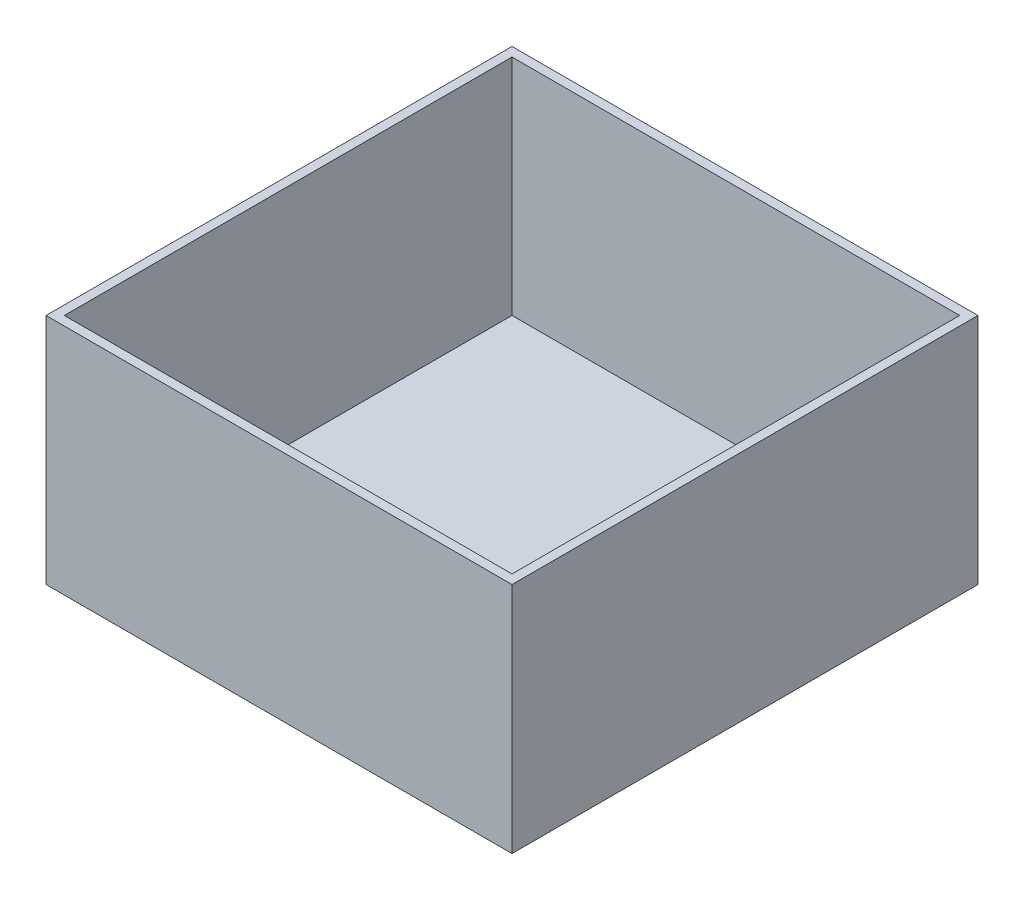
ISO-10303-21;
HEADER;
FILE_DESCRIPTION(('STEP AP214'),'2;1');
FILE_NAME('part.step','',(''),(''),'','','');
FILE_SCHEMA(('AUTOMOTIVE_DESIGN { 1 0 10303 214 1 1 1 1 }'));
ENDSEC;
DATA;
#1=APPLICATION_CONTEXT('core data for automotive mechanical design processes');
#2=APPLICATION_PROTOCOL_DEFINITION('international standard','automotive_design',2000,#1);
#3=PRODUCT_CONTEXT('',#1,'mechanical');
#4=PRODUCT('Part','Part','',(#3));
#5=PRODUCT_RELATED_PRODUCT_CATEGORY('part','',(#4));
#6=PRODUCT_DEFINITION_FORMATION('','',#4);
#7=PRODUCT_DEFINITION_CONTEXT('part definition',#1,'design');
#8=PRODUCT_DEFINITION('design','',#6,#7);
#9=PRODUCT_DEFINITION_SHAPE('','',#8);
#10=(LENGTH_UNIT() NAMED_UNIT(*) SI_UNIT(.MILLI.,.METRE.));
#11=(NAMED_UNIT(*) PLANE_ANGLE_UNIT() SI_UNIT($,.RADIAN.));
#12=(NAMED_UNIT(*) SI_UNIT($,.STERADIAN.) SOLID_ANGLE_UNIT());
#13=UNCERTAINTY_MEASURE_WITH_UNIT(LENGTH_MEASURE(1.E-05),#10,'distance_accuracy_value','');
#14=(GEOMETRIC_REPRESENTATION_CONTEXT(3) GLOBAL_UNCERTAINTY_ASSIGNED_CONTEXT((#13)) GLOBAL_UNIT_ASSIGNED_CONTEXT((#10,
#11,#12)) REPRESENTATION_CONTEXT('',''));
#15=CARTESIAN_POINT('',(0.,0.,0.));
#16=DIRECTION('',(0.,0.,1.));
#17=DIRECTION('',(1.,0.,0.));
#18=AXIS2_PLACEMENT_3D('',#15,#16,#17);
#19=CARTESIAN_POINT('',(-50.8,50.8,50.8));
#20=DIRECTION('',(1.,0.,0.));
#21=DIRECTION('',(0.,0.,-1.));
#22=AXIS2_PLACEMENT_3D('',#19,#20,#21);
#23=PLANE('',#22);
#24=DIRECTION('',(0.,0.,1.));
#25=VECTOR('',#24,1.);
#26=CARTESIAN_POINT('',(-50.8,0.,50.8));
#27=LINE('',#26,#25);
#28=CARTESIAN_POINT('',(-50.8,0.,-50.8));
#29=VERTEX_POINT('',#28);
#30=CARTESIAN_POINT('',(-50.8,0.,50.8));
#31=VERTEX_POINT('',#30);
#32=EDGE_CURVE('E147',#29,#31,#27,.T.);
#33=ORIENTED_EDGE('',*,*,#32,.T.);
#34=DIRECTION('',(0.,-1.,0.));
#35=VECTOR('',#34,1.);
#36=CARTESIAN_POINT('',(-50.8,50.8,50.8));
#37=LINE('',#36,#35);
#38=CARTESIAN_POINT('',(-50.8,50.8,50.8));
#39=VERTEX_POINT('',#38);
#40=EDGE_CURVE('E11',#39,#31,#37,.T.);
#41=ORIENTED_EDGE('',*,*,#40,.F.);
#42=DIRECTION('',(0.,0.,1.));
#43=VECTOR('',#42,1.);
#44=CARTESIAN_POINT('',(-50.8,50.8,50.8));
#45=LINE('',#44,#43);
#46=CARTESIAN_POINT('',(-50.8,50.8,-50.8));
#47=VERTEX_POINT('',#46);
#48=EDGE_CURVE('E140',#47,#39,#45,.T.);
#49=ORIENTED_EDGE('',*,*,#48,.F.);
#50=DIRECTION('',(0.,-1.,0.));
#51=VECTOR('',#50,1.);
#52=CARTESIAN_POINT('',(-50.8,50.8,-50.8));
#53=LINE('',#52,#51);
#54=EDGE_CURVE('E146',#47,#29,#53,.T.);
#55=ORIENTED_EDGE('',*,*,#54,.T.);
#56=EDGE_LOOP('',(#33,#41,#49,#55));
#57=FACE_BOUND('',#56,.T.);
#58=ADVANCED_FACE('F33',(#57),#23,.F.);
#59=CARTESIAN_POINT('',(50.8,50.8,50.8));
#60=DIRECTION('',(0.,0.,-1.));
#61=DIRECTION('',(-1.,0.,0.));
#62=AXIS2_PLACEMENT_3D('',#59,#60,#61);
#63=PLANE('',#62);
#64=DIRECTION('',(1.,0.,0.));
#65=VECTOR('',#64,1.);
#66=CARTESIAN_POINT('',(50.8,0.,50.8));
#67=LINE('',#66,#65);
#68=CARTESIAN_POINT('',(50.8,0.,50.8));
#69=VERTEX_POINT('',#68);
#70=EDGE_CURVE('E150',#31,#69,#67,.T.);
#71=ORIENTED_EDGE('',*,*,#70,.T.);
#72=DIRECTION('',(0.,-1.,0.));
#73=VECTOR('',#72,1.);
#74=CARTESIAN_POINT('',(50.8,50.8,50.8));
#75=LINE('',#74,#73);
#76=CARTESIAN_POINT('',(50.8,50.8,50.8));
#77=VERTEX_POINT('',#76);
#78=EDGE_CURVE('E40',#77,#69,#75,.T.);
#79=ORIENTED_EDGE('',*,*,#78,.F.);
#80=DIRECTION('',(1.,0.,0.));
#81=VECTOR('',#80,1.);
#82=CARTESIAN_POINT('',(50.8,50.8,50.8));
#83=LINE('',#82,#81);
#84=EDGE_CURVE('E84',#39,#77,#83,.T.);
#85=ORIENTED_EDGE('',*,*,#84,.F.);
#86=ORIENTED_EDGE('',*,*,#40,.T.);
#87=EDGE_LOOP('',(#71,#79,#85,#86));
#88=FACE_BOUND('',#87,.T.);
#89=ADVANCED_FACE('F179',(#88),#63,.F.);
#90=CARTESIAN_POINT('',(50.8,50.8,50.8));
#91=DIRECTION('',(-1.,0.,0.));
#92=DIRECTION('',(0.,0.,1.));
#93=AXIS2_PLACEMENT_3D('',#90,#91,#92);
#94=PLANE('',#93);
#95=DIRECTION('',(0.,0.,-1.));
#96=VECTOR('',#95,1.);
#97=CARTESIAN_POINT('',(50.8,0.,50.8));
#98=LINE('',#97,#96);
#99=CARTESIAN_POINT('',(50.8,0.,-50.8));
#100=VERTEX_POINT('',#99);
#101=EDGE_CURVE('E152',#69,#100,#98,.T.);
#102=ORIENTED_EDGE('',*,*,#101,.T.);
#103=DIRECTION('',(0.,-1.,0.));
#104=VECTOR('',#103,1.);
#105=CARTESIAN_POINT('',(50.8,50.8,-50.8));
#106=LINE('',#105,#104);
#107=CARTESIAN_POINT('',(50.8,50.8,-50.8));
#108=VERTEX_POINT('',#107);
#109=EDGE_CURVE('E156',#108,#100,#106,.T.);
#110=ORIENTED_EDGE('',*,*,#109,.F.);
#111=DIRECTION('',(0.,0.,-1.));
#112=VECTOR('',#111,1.);
#113=CARTESIAN_POINT('',(50.8,50.8,50.8));
#114=LINE('',#113,#112);
#115=EDGE_CURVE('E143',#77,#108,#114,.T.);
#116=ORIENTED_EDGE('',*,*,#115,.F.);
#117=ORIENTED_EDGE('',*,*,#78,.T.);
#118=EDGE_LOOP('',(#102,#110,#116,#117));
#119=FACE_BOUND('',#118,.T.);
#120=ADVANCED_FACE('F161',(#119),#94,.F.);
#121=CARTESIAN_POINT('',(50.8,50.8,-50.8));
#122=DIRECTION('',(0.,0.,1.));
#123=DIRECTION('',(1.,0.,0.));
#124=AXIS2_PLACEMENT_3D('',#121,#122,#123);
#125=PLANE('',#124);
#126=DIRECTION('',(-1.,0.,0.));
#127=VECTOR('',#126,1.);
#128=CARTESIAN_POINT('',(50.8,0.,-50.8));
#129=LINE('',#128,#127);
#130=EDGE_CURVE('E77',#100,#29,#129,.T.);
#131=ORIENTED_EDGE('',*,*,#130,.T.);
#132=ORIENTED_EDGE('',*,*,#54,.F.);
#133=DIRECTION('',(-1.,0.,0.));
#134=VECTOR('',#133,1.);
#135=CARTESIAN_POINT('',(50.8,50.8,-50.8));
#136=LINE('',#135,#134);
#137=EDGE_CURVE('E56',#108,#47,#136,.T.);
#138=ORIENTED_EDGE('',*,*,#137,.F.);
#139=ORIENTED_EDGE('',*,*,#109,.T.);
#140=EDGE_LOOP('',(#131,#132,#138,#139));
#141=FACE_BOUND('',#140,.T.);
#142=ADVANCED_FACE('F169',(#141),#125,.F.);
#143=CARTESIAN_POINT('',(0.,50.8,0.));
#144=DIRECTION('',(0.,1.,0.));
#145=DIRECTION('',(0.,0.,1.));
#146=AXIS2_PLACEMENT_3D('',#143,#144,#145);
#147=PLANE('',#146);
#148=DIRECTION('',(0.,0.,1.));
#149=VECTOR('',#148,1.);
#150=CARTESIAN_POINT('',(-48.8,50.8,50.8));
#151=LINE('',#150,#149);
#152=CARTESIAN_POINT('',(-48.8,50.8,-48.8));
#153=VERTEX_POINT('',#152);
#154=CARTESIAN_POINT('',(-48.8,50.8,48.8));
#155=VERTEX_POINT('',#154);
#156=EDGE_CURVE('E129',#153,#155,#151,.T.);
#157=ORIENTED_EDGE('',*,*,#156,.F.);
#158=DIRECTION('',(-1.,0.,0.));
#159=VECTOR('',#158,1.);
#160=CARTESIAN_POINT('',(50.8,50.8,-48.8));
#161=LINE('',#160,#159);
#162=CARTESIAN_POINT('',(48.8,50.8,-48.8));
#163=VERTEX_POINT('',#162);
#164=EDGE_CURVE('E138',#163,#153,#161,.T.);
#165=ORIENTED_EDGE('',*,*,#164,.F.);
#166=DIRECTION('',(0.,0.,-1.));
#167=VECTOR('',#166,1.);
#168=CARTESIAN_POINT('',(48.8,50.8,50.8));
#169=LINE('',#168,#167);
#170=CARTESIAN_POINT('',(48.8,50.8,48.8));
#171=VERTEX_POINT('',#170);
#172=EDGE_CURVE('E136',#171,#163,#169,.T.);
#173=ORIENTED_EDGE('',*,*,#172,.F.);
#174=DIRECTION('',(1.,0.,0.));
#175=VECTOR('',#174,1.);
#176=CARTESIAN_POINT('',(50.8,50.8,48.8));
#177=LINE('',#176,#175);
#178=EDGE_CURVE('E121',#155,#171,#177,.T.);
#179=ORIENTED_EDGE('',*,*,#178,.F.);
#180=EDGE_LOOP('',(#157,#165,#173,#179));
#181=FACE_BOUND('',#180,.T.);
#182=ORIENTED_EDGE('',*,*,#48,.T.);
#183=ORIENTED_EDGE('',*,*,#84,.T.);
#184=ORIENTED_EDGE('',*,*,#115,.T.);
#185=ORIENTED_EDGE('',*,*,#137,.T.);
#186=EDGE_LOOP('',(#182,#183,#184,#185));
#187=FACE_BOUND('',#186,.T.);
#188=ADVANCED_FACE('F171',(#181,#187),#147,.T.);
#189=CARTESIAN_POINT('',(0.,0.,0.));
#190=DIRECTION('',(0.,1.,0.));
#191=DIRECTION('',(0.,0.,1.));
#192=AXIS2_PLACEMENT_3D('',#189,#190,#191);
#193=PLANE('',#192);
#194=ORIENTED_EDGE('',*,*,#32,.F.);
#195=ORIENTED_EDGE('',*,*,#130,.F.);
#196=ORIENTED_EDGE('',*,*,#101,.F.);
#197=ORIENTED_EDGE('',*,*,#70,.F.);
#198=EDGE_LOOP('',(#194,#195,#196,#197));
#199=FACE_BOUND('',#198,.T.);
#200=ADVANCED_FACE('F165',(#199),#193,.F.);
#201=CARTESIAN_POINT('',(-48.8,50.8,50.8));
#202=DIRECTION('',(1.,0.,0.));
#203=DIRECTION('',(0.,0.,-1.));
#204=AXIS2_PLACEMENT_3D('',#201,#202,#203);
#205=PLANE('',#204);
#206=DIRECTION('',(0.,0.,1.));
#207=VECTOR('',#206,1.);
#208=CARTESIAN_POINT('',(-48.8,2.,50.8));
#209=LINE('',#208,#207);
#210=CARTESIAN_POINT('',(-48.8,2.,-48.8));
#211=VERTEX_POINT('',#210);
#212=CARTESIAN_POINT('',(-48.8,2.,48.8));
#213=VERTEX_POINT('',#212);
#214=EDGE_CURVE('E112',#211,#213,#209,.T.);
#215=ORIENTED_EDGE('',*,*,#214,.F.);
#216=DIRECTION('',(0.,-1.,0.));
#217=VECTOR('',#216,1.);
#218=CARTESIAN_POINT('',(-48.8,50.8,-48.8));
#219=LINE('',#218,#217);
#220=EDGE_CURVE('E132',#153,#211,#219,.T.);
#221=ORIENTED_EDGE('',*,*,#220,.F.);
#222=ORIENTED_EDGE('',*,*,#156,.T.);
#223=DIRECTION('',(0.,-1.,0.));
#224=VECTOR('',#223,1.);
#225=CARTESIAN_POINT('',(-48.8,50.8,48.8));
#226=LINE('',#225,#224);
#227=EDGE_CURVE('E124',#155,#213,#226,.T.);
#228=ORIENTED_EDGE('',*,*,#227,.T.);
#229=EDGE_LOOP('',(#215,#221,#222,#228));
#230=FACE_BOUND('',#229,.T.);
#231=ADVANCED_FACE('F206',(#230),#205,.T.);
#232=CARTESIAN_POINT('',(50.8,50.8,48.8));
#233=DIRECTION('',(0.,0.,-1.));
#234=DIRECTION('',(-1.,0.,0.));
#235=AXIS2_PLACEMENT_3D('',#232,#233,#234);
#236=PLANE('',#235);
#237=DIRECTION('',(1.,0.,0.));
#238=VECTOR('',#237,1.);
#239=CARTESIAN_POINT('',(50.8,2.,48.8));
#240=LINE('',#239,#238);
#241=CARTESIAN_POINT('',(48.8,2.,48.8));
#242=VERTEX_POINT('',#241);
#243=EDGE_CURVE('E106',#213,#242,#240,.T.);
#244=ORIENTED_EDGE('',*,*,#243,.F.);
#245=ORIENTED_EDGE('',*,*,#227,.F.);
#246=ORIENTED_EDGE('',*,*,#178,.T.);
#247=DIRECTION('',(0.,-1.,0.));
#248=VECTOR('',#247,1.);
#249=CARTESIAN_POINT('',(48.8,50.8,48.8));
#250=LINE('',#249,#248);
#251=EDGE_CURVE('E118',#171,#242,#250,.T.);
#252=ORIENTED_EDGE('',*,*,#251,.T.);
#253=EDGE_LOOP('',(#244,#245,#246,#252));
#254=FACE_BOUND('',#253,.T.);
#255=ADVANCED_FACE('F119',(#254),#236,.T.);
#256=CARTESIAN_POINT('',(48.8,50.8,50.8));
#257=DIRECTION('',(-1.,0.,0.));
#258=DIRECTION('',(0.,0.,1.));
#259=AXIS2_PLACEMENT_3D('',#256,#257,#258);
#260=PLANE('',#259);
#261=DIRECTION('',(0.,0.,-1.));
#262=VECTOR('',#261,1.);
#263=CARTESIAN_POINT('',(48.8,2.,50.8));
#264=LINE('',#263,#262);
#265=CARTESIAN_POINT('',(48.8,2.,-48.8));
#266=VERTEX_POINT('',#265);
#267=EDGE_CURVE('E110',#242,#266,#264,.T.);
#268=ORIENTED_EDGE('',*,*,#267,.F.);
#269=ORIENTED_EDGE('',*,*,#251,.F.);
#270=ORIENTED_EDGE('',*,*,#172,.T.);
#271=DIRECTION('',(0.,-1.,0.));
#272=VECTOR('',#271,1.);
#273=CARTESIAN_POINT('',(48.8,50.8,-48.8));
#274=LINE('',#273,#272);
#275=EDGE_CURVE('E47',#163,#266,#274,.T.);
#276=ORIENTED_EDGE('',*,*,#275,.T.);
#277=EDGE_LOOP('',(#268,#269,#270,#276));
#278=FACE_BOUND('',#277,.T.);
#279=ADVANCED_FACE('F126',(#278),#260,.T.);
#280=CARTESIAN_POINT('',(50.8,50.8,-48.8));
#281=DIRECTION('',(0.,0.,1.));
#282=DIRECTION('',(1.,0.,0.));
#283=AXIS2_PLACEMENT_3D('',#280,#281,#282);
#284=PLANE('',#283);
#285=DIRECTION('',(-1.,0.,0.));
#286=VECTOR('',#285,1.);
#287=CARTESIAN_POINT('',(50.8,2.,-48.8));
#288=LINE('',#287,#286);
#289=EDGE_CURVE('E127',#266,#211,#288,.T.);
#290=ORIENTED_EDGE('',*,*,#289,.F.);
#291=ORIENTED_EDGE('',*,*,#275,.F.);
#292=ORIENTED_EDGE('',*,*,#164,.T.);
#293=ORIENTED_EDGE('',*,*,#220,.T.);
#294=EDGE_LOOP('',(#290,#291,#292,#293));
#295=FACE_BOUND('',#294,.T.);
#296=ADVANCED_FACE('F236',(#295),#284,.T.);
#297=CARTESIAN_POINT('',(0.,2.,0.));
#298=DIRECTION('',(0.,1.,0.));
#299=DIRECTION('',(0.,0.,1.));
#300=AXIS2_PLACEMENT_3D('',#297,#298,#299);
#301=PLANE('',#300);
#302=ORIENTED_EDGE('',*,*,#214,.T.);
#303=ORIENTED_EDGE('',*,*,#243,.T.);
#304=ORIENTED_EDGE('',*,*,#267,.T.);
#305=ORIENTED_EDGE('',*,*,#289,.T.);
#306=EDGE_LOOP('',(#302,#303,#304,#305));
#307=FACE_BOUND('',#306,.T.);
#308=ADVANCED_FACE('F108',(#307),#301,.T.);
#309=CLOSED_SHELL('',(#58,#89,#120,#142,#188,#200,#231,#255,#279,#296,#308));
#310=MANIFOLD_SOLID_BREP('B2',#309);
#311=ADVANCED_BREP_SHAPE_REPRESENTATION('',(#18,#310),#14);
#312=SHAPE_DEFINITION_REPRESENTATION(#9,#311);
ENDSEC;
END-ISO-10303-21;
